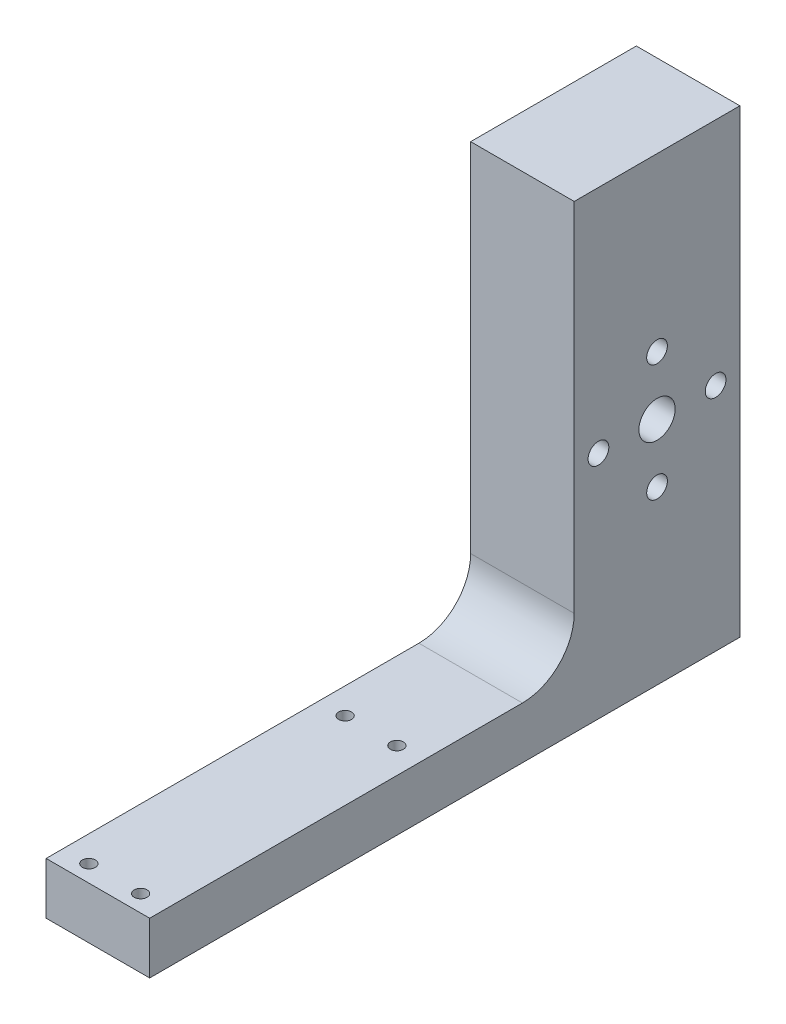
ISO-10303-21;
HEADER;
FILE_DESCRIPTION(('STEP AP214'),'2;1');
FILE_NAME('part.step','',(''),(''),'','','');
FILE_SCHEMA(('AUTOMOTIVE_DESIGN { 1 0 10303 214 1 1 1 1 }'));
ENDSEC;
DATA;
#1=APPLICATION_CONTEXT('core data for automotive mechanical design processes');
#2=APPLICATION_PROTOCOL_DEFINITION('international standard','automotive_design',2000,#1);
#3=PRODUCT_CONTEXT('',#1,'mechanical');
#4=PRODUCT('Part','Part','',(#3));
#5=PRODUCT_RELATED_PRODUCT_CATEGORY('part','',(#4));
#6=PRODUCT_DEFINITION_FORMATION('','',#4);
#7=PRODUCT_DEFINITION_CONTEXT('part definition',#1,'design');
#8=PRODUCT_DEFINITION('design','',#6,#7);
#9=PRODUCT_DEFINITION_SHAPE('','',#8);
#10=(LENGTH_UNIT() NAMED_UNIT(*) SI_UNIT(.MILLI.,.METRE.));
#11=(NAMED_UNIT(*) PLANE_ANGLE_UNIT() SI_UNIT($,.RADIAN.));
#12=(NAMED_UNIT(*) SI_UNIT($,.STERADIAN.) SOLID_ANGLE_UNIT());
#13=UNCERTAINTY_MEASURE_WITH_UNIT(LENGTH_MEASURE(1.E-05),#10,'distance_accuracy_value','');
#14=(GEOMETRIC_REPRESENTATION_CONTEXT(3) GLOBAL_UNCERTAINTY_ASSIGNED_CONTEXT((#13)) GLOBAL_UNIT_ASSIGNED_CONTEXT((#10,
#11,#12)) REPRESENTATION_CONTEXT('',''));
#15=CARTESIAN_POINT('',(0.,0.,0.));
#16=DIRECTION('',(0.,0.,1.));
#17=DIRECTION('',(1.,0.,0.));
#18=AXIS2_PLACEMENT_3D('',#15,#16,#17);
#19=CARTESIAN_POINT('',(20.,10.,0.));
#20=DIRECTION('',(-1.,0.,0.));
#21=DIRECTION('',(0.,0.,1.));
#22=AXIS2_PLACEMENT_3D('',#19,#20,#21);
#23=PLANE('',#22);
#24=CARTESIAN_POINT('',(20.,44.45,-103.313708498985));
#25=DIRECTION('',(1.,0.,0.));
#26=DIRECTION('',(0.,0.,-1.));
#27=AXIS2_PLACEMENT_3D('',#24,#25,#26);
#28=CIRCLE('',#27,2.);
#29=CARTESIAN_POINT('',(20.,44.45,-105.313708498985));
#30=VERTEX_POINT('',#29);
#31=EDGE_CURVE('E352',#30,#30,#28,.T.);
#32=ORIENTED_EDGE('',*,*,#31,.F.);
#33=EDGE_LOOP('',(#32));
#34=FACE_BOUND('',#33,.T.);
#35=CARTESIAN_POINT('',(20.,33.1362915010152,-92.));
#36=DIRECTION('',(1.,0.,0.));
#37=DIRECTION('',(0.,0.,-1.));
#38=AXIS2_PLACEMENT_3D('',#35,#36,#37);
#39=CIRCLE('',#38,2.);
#40=CARTESIAN_POINT('',(20.,33.1362915010152,-94.));
#41=VERTEX_POINT('',#40);
#42=EDGE_CURVE('E351',#41,#41,#39,.T.);
#43=ORIENTED_EDGE('',*,*,#42,.F.);
#44=EDGE_LOOP('',(#43));
#45=FACE_BOUND('',#44,.T.);
#46=CARTESIAN_POINT('',(20.,44.45,-80.6862915010152));
#47=DIRECTION('',(1.,0.,0.));
#48=DIRECTION('',(0.,0.,-1.));
#49=AXIS2_PLACEMENT_3D('',#46,#47,#48);
#50=CIRCLE('',#49,2.);
#51=CARTESIAN_POINT('',(20.,44.45,-82.6862915010152));
#52=VERTEX_POINT('',#51);
#53=EDGE_CURVE('E353',#52,#52,#50,.T.);
#54=ORIENTED_EDGE('',*,*,#53,.F.);
#55=EDGE_LOOP('',(#54));
#56=FACE_BOUND('',#55,.T.);
#57=CARTESIAN_POINT('',(20.,55.7637084989848,-92.));
#58=DIRECTION('',(1.,0.,0.));
#59=DIRECTION('',(0.,0.,-1.));
#60=AXIS2_PLACEMENT_3D('',#57,#58,#59);
#61=CIRCLE('',#60,2.);
#62=CARTESIAN_POINT('',(20.,55.7637084989848,-94.));
#63=VERTEX_POINT('',#62);
#64=EDGE_CURVE('E357',#63,#63,#61,.T.);
#65=ORIENTED_EDGE('',*,*,#64,.F.);
#66=EDGE_LOOP('',(#65));
#67=FACE_BOUND('',#66,.T.);
#68=CARTESIAN_POINT('',(20.,44.45,-92.));
#69=DIRECTION('',(1.,0.,0.));
#70=DIRECTION('',(0.,0.,-1.));
#71=AXIS2_PLACEMENT_3D('',#68,#69,#70);
#72=CIRCLE('',#71,3.50000000000001);
#73=CARTESIAN_POINT('',(20.,44.45,-95.5));
#74=VERTEX_POINT('',#73);
#75=EDGE_CURVE('E125',#74,#74,#72,.T.);
#76=ORIENTED_EDGE('',*,*,#75,.F.);
#77=EDGE_LOOP('',(#76));
#78=FACE_BOUND('',#77,.T.);
#79=DIRECTION('',(0.,0.,-1.));
#80=VECTOR('',#79,1.);
#81=CARTESIAN_POINT('',(20.,0.,0.));
#82=LINE('',#81,#80);
#83=CARTESIAN_POINT('',(20.,0.,6.));
#84=VERTEX_POINT('',#83);
#85=CARTESIAN_POINT('',(20.,0.,-108.));
#86=VERTEX_POINT('',#85);
#87=EDGE_CURVE('E95',#84,#86,#82,.T.);
#88=ORIENTED_EDGE('',*,*,#87,.T.);
#89=DIRECTION('',(0.,-1.,0.));
#90=VECTOR('',#89,1.);
#91=CARTESIAN_POINT('',(20.,0.,-108.));
#92=LINE('',#91,#90);
#93=CARTESIAN_POINT('',(20.,88.9,-108.));
#94=VERTEX_POINT('',#93);
#95=EDGE_CURVE('E99',#94,#86,#92,.T.);
#96=ORIENTED_EDGE('',*,*,#95,.F.);
#97=DIRECTION('',(0.,0.,1.));
#98=VECTOR('',#97,1.);
#99=CARTESIAN_POINT('',(20.,88.9,-108.));
#100=LINE('',#99,#98);
#101=CARTESIAN_POINT('',(20.,88.9,-76.));
#102=VERTEX_POINT('',#101);
#103=EDGE_CURVE('E130',#94,#102,#100,.T.);
#104=ORIENTED_EDGE('',*,*,#103,.T.);
#105=DIRECTION('',(0.,-1.,0.));
#106=VECTOR('',#105,1.);
#107=CARTESIAN_POINT('',(20.,0.,-76.));
#108=LINE('',#107,#106);
#109=CARTESIAN_POINT('',(20.,20.,-76.));
#110=VERTEX_POINT('',#109);
#111=EDGE_CURVE('E131',#102,#110,#108,.T.);
#112=ORIENTED_EDGE('',*,*,#111,.T.);
#113=CARTESIAN_POINT('',(20.,20.,-66.));
#114=DIRECTION('',(-1.,0.,0.));
#115=DIRECTION('',(0.,0.,1.));
#116=AXIS2_PLACEMENT_3D('',#113,#114,#115);
#117=CIRCLE('',#116,10.);
#118=CARTESIAN_POINT('',(20.,10.,-66.));
#119=VERTEX_POINT('',#118);
#120=EDGE_CURVE('E44',#110,#119,#117,.T.);
#121=ORIENTED_EDGE('',*,*,#120,.T.);
#122=DIRECTION('',(0.,0.,-1.));
#123=VECTOR('',#122,1.);
#124=CARTESIAN_POINT('',(20.,10.,0.));
#125=LINE('',#124,#123);
#126=CARTESIAN_POINT('',(20.,10.,6.));
#127=VERTEX_POINT('',#126);
#128=EDGE_CURVE('E137',#127,#119,#125,.T.);
#129=ORIENTED_EDGE('',*,*,#128,.F.);
#130=DIRECTION('',(0.,-1.,0.));
#131=VECTOR('',#130,1.);
#132=CARTESIAN_POINT('',(20.,10.,6.));
#133=LINE('',#132,#131);
#134=EDGE_CURVE('E100',#127,#84,#133,.T.);
#135=ORIENTED_EDGE('',*,*,#134,.T.);
#136=EDGE_LOOP('',(#88,#96,#104,#112,#121,#129,#135));
#137=FACE_BOUND('',#136,.T.);
#138=ADVANCED_FACE('F35',(#34,#45,#56,#67,#78,#137),#23,.F.);
#139=CARTESIAN_POINT('',(0.,10.,0.));
#140=DIRECTION('',(-1.,0.,0.));
#141=DIRECTION('',(0.,0.,1.));
#142=AXIS2_PLACEMENT_3D('',#139,#140,#141);
#143=PLANE('',#142);
#144=CARTESIAN_POINT('',(0.,44.45,-103.313708498985));
#145=DIRECTION('',(-1.,0.,0.));
#146=DIRECTION('',(0.,0.,1.));
#147=AXIS2_PLACEMENT_3D('',#144,#145,#146);
#148=CIRCLE('',#147,2.);
#149=CARTESIAN_POINT('',(0.,44.45,-101.313708498985));
#150=VERTEX_POINT('',#149);
#151=EDGE_CURVE('E39',#150,#150,#148,.T.);
#152=ORIENTED_EDGE('',*,*,#151,.F.);
#153=EDGE_LOOP('',(#152));
#154=FACE_BOUND('',#153,.T.);
#155=CARTESIAN_POINT('',(0.,33.1362915010152,-92.));
#156=DIRECTION('',(-1.,0.,0.));
#157=DIRECTION('',(0.,0.,1.));
#158=AXIS2_PLACEMENT_3D('',#155,#156,#157);
#159=CIRCLE('',#158,2.);
#160=CARTESIAN_POINT('',(0.,33.1362915010152,-90.));
#161=VERTEX_POINT('',#160);
#162=EDGE_CURVE('E187',#161,#161,#159,.T.);
#163=ORIENTED_EDGE('',*,*,#162,.F.);
#164=EDGE_LOOP('',(#163));
#165=FACE_BOUND('',#164,.T.);
#166=CARTESIAN_POINT('',(0.,44.45,-80.6862915010152));
#167=DIRECTION('',(-1.,0.,0.));
#168=DIRECTION('',(0.,0.,1.));
#169=AXIS2_PLACEMENT_3D('',#166,#167,#168);
#170=CIRCLE('',#169,2.);
#171=CARTESIAN_POINT('',(0.,44.45,-78.6862915010152));
#172=VERTEX_POINT('',#171);
#173=EDGE_CURVE('E185',#172,#172,#170,.T.);
#174=ORIENTED_EDGE('',*,*,#173,.F.);
#175=EDGE_LOOP('',(#174));
#176=FACE_BOUND('',#175,.T.);
#177=CARTESIAN_POINT('',(0.,55.7637084989848,-92.));
#178=DIRECTION('',(-1.,0.,0.));
#179=DIRECTION('',(0.,0.,1.));
#180=AXIS2_PLACEMENT_3D('',#177,#178,#179);
#181=CIRCLE('',#180,2.);
#182=CARTESIAN_POINT('',(0.,55.7637084989848,-90.));
#183=VERTEX_POINT('',#182);
#184=EDGE_CURVE('E182',#183,#183,#181,.T.);
#185=ORIENTED_EDGE('',*,*,#184,.F.);
#186=EDGE_LOOP('',(#185));
#187=FACE_BOUND('',#186,.T.);
#188=CARTESIAN_POINT('',(0.,44.45,-92.));
#189=DIRECTION('',(-1.,0.,0.));
#190=DIRECTION('',(0.,0.,1.));
#191=AXIS2_PLACEMENT_3D('',#188,#189,#190);
#192=CIRCLE('',#191,3.50000000000001);
#193=CARTESIAN_POINT('',(0.,44.45,-88.5));
#194=VERTEX_POINT('',#193);
#195=EDGE_CURVE('E179',#194,#194,#192,.T.);
#196=ORIENTED_EDGE('',*,*,#195,.F.);
#197=EDGE_LOOP('',(#196));
#198=FACE_BOUND('',#197,.T.);
#199=DIRECTION('',(0.,0.,-1.));
#200=VECTOR('',#199,1.);
#201=CARTESIAN_POINT('',(0.,0.,0.));
#202=LINE('',#201,#200);
#203=CARTESIAN_POINT('',(0.,0.,6.));
#204=VERTEX_POINT('',#203);
#205=CARTESIAN_POINT('',(0.,0.,-108.));
#206=VERTEX_POINT('',#205);
#207=EDGE_CURVE('E104',#204,#206,#202,.T.);
#208=ORIENTED_EDGE('',*,*,#207,.F.);
#209=DIRECTION('',(0.,-1.,0.));
#210=VECTOR('',#209,1.);
#211=CARTESIAN_POINT('',(0.,10.,6.));
#212=LINE('',#211,#210);
#213=CARTESIAN_POINT('',(0.,10.,6.));
#214=VERTEX_POINT('',#213);
#215=EDGE_CURVE('E172',#214,#204,#212,.T.);
#216=ORIENTED_EDGE('',*,*,#215,.F.);
#217=DIRECTION('',(0.,0.,-1.));
#218=VECTOR('',#217,1.);
#219=CARTESIAN_POINT('',(0.,10.,0.));
#220=LINE('',#219,#218);
#221=CARTESIAN_POINT('',(0.,10.,-66.));
#222=VERTEX_POINT('',#221);
#223=EDGE_CURVE('E139',#214,#222,#220,.T.);
#224=ORIENTED_EDGE('',*,*,#223,.T.);
#225=CARTESIAN_POINT('',(0.,20.,-66.));
#226=DIRECTION('',(-1.,0.,0.));
#227=DIRECTION('',(0.,0.,1.));
#228=AXIS2_PLACEMENT_3D('',#225,#226,#227);
#229=CIRCLE('',#228,10.);
#230=CARTESIAN_POINT('',(0.,20.,-76.));
#231=VERTEX_POINT('',#230);
#232=EDGE_CURVE('E11',#222,#231,#229,.F.);
#233=ORIENTED_EDGE('',*,*,#232,.T.);
#234=DIRECTION('',(0.,1.,0.));
#235=VECTOR('',#234,1.);
#236=CARTESIAN_POINT('',(0.,0.,-76.));
#237=LINE('',#236,#235);
#238=CARTESIAN_POINT('',(0.,88.9,-76.));
#239=VERTEX_POINT('',#238);
#240=EDGE_CURVE('E122',#231,#239,#237,.T.);
#241=ORIENTED_EDGE('',*,*,#240,.T.);
#242=DIRECTION('',(0.,0.,1.));
#243=VECTOR('',#242,1.);
#244=CARTESIAN_POINT('',(0.,88.9,-108.));
#245=LINE('',#244,#243);
#246=CARTESIAN_POINT('',(0.,88.9,-108.));
#247=VERTEX_POINT('',#246);
#248=EDGE_CURVE('E105',#247,#239,#245,.T.);
#249=ORIENTED_EDGE('',*,*,#248,.F.);
#250=DIRECTION('',(0.,1.,0.));
#251=VECTOR('',#250,1.);
#252=CARTESIAN_POINT('',(0.,0.,-108.));
#253=LINE('',#252,#251);
#254=EDGE_CURVE('E114',#206,#247,#253,.T.);
#255=ORIENTED_EDGE('',*,*,#254,.F.);
#256=EDGE_LOOP('',(#208,#216,#224,#233,#241,#249,#255));
#257=FACE_BOUND('',#256,.T.);
#258=ADVANCED_FACE('F197',(#154,#165,#176,#187,#198,#257),#143,.T.);
#259=CARTESIAN_POINT('',(15.,10.,-46.75));
#260=DIRECTION('',(0.,-1.,0.));
#261=DIRECTION('',(0.,0.,-1.));
#262=AXIS2_PLACEMENT_3D('',#259,#260,#261);
#263=CYLINDRICAL_SURFACE('',#262,1.25);
#264=CARTESIAN_POINT('',(15.,10.,-46.75));
#265=DIRECTION('',(0.,1.,0.));
#266=DIRECTION('',(0.,0.,1.));
#267=AXIS2_PLACEMENT_3D('',#264,#265,#266);
#268=CIRCLE('',#267,1.25);
#269=CARTESIAN_POINT('',(15.,10.,-45.5));
#270=VERTEX_POINT('',#269);
#271=EDGE_CURVE('E151',#270,#270,#268,.T.);
#272=ORIENTED_EDGE('',*,*,#271,.T.);
#273=EDGE_LOOP('',(#272));
#274=FACE_BOUND('',#273,.T.);
#275=CARTESIAN_POINT('',(15.,0.,-46.75));
#276=DIRECTION('',(0.,1.,0.));
#277=DIRECTION('',(0.,0.,1.));
#278=AXIS2_PLACEMENT_3D('',#275,#276,#277);
#279=CIRCLE('',#278,1.25);
#280=CARTESIAN_POINT('',(15.,0.,-45.5));
#281=VERTEX_POINT('',#280);
#282=EDGE_CURVE('E166',#281,#281,#279,.T.);
#283=ORIENTED_EDGE('',*,*,#282,.F.);
#284=EDGE_LOOP('',(#283));
#285=FACE_BOUND('',#284,.T.);
#286=ADVANCED_FACE('F200',(#274,#285),#263,.F.);
#287=CARTESIAN_POINT('',(5.,10.,2.75));
#288=DIRECTION('',(0.,-1.,0.));
#289=DIRECTION('',(0.,0.,-1.));
#290=AXIS2_PLACEMENT_3D('',#287,#288,#289);
#291=CYLINDRICAL_SURFACE('',#290,1.25);
#292=CARTESIAN_POINT('',(5.,10.,2.75));
#293=DIRECTION('',(0.,1.,0.));
#294=DIRECTION('',(0.,0.,1.));
#295=AXIS2_PLACEMENT_3D('',#292,#293,#294);
#296=CIRCLE('',#295,1.25);
#297=CARTESIAN_POINT('',(5.,10.,4.));
#298=VERTEX_POINT('',#297);
#299=EDGE_CURVE('E148',#298,#298,#296,.T.);
#300=ORIENTED_EDGE('',*,*,#299,.T.);
#301=EDGE_LOOP('',(#300));
#302=FACE_BOUND('',#301,.T.);
#303=CARTESIAN_POINT('',(5.,0.,2.75));
#304=DIRECTION('',(0.,1.,0.));
#305=DIRECTION('',(0.,0.,1.));
#306=AXIS2_PLACEMENT_3D('',#303,#304,#305);
#307=CIRCLE('',#306,1.25);
#308=CARTESIAN_POINT('',(5.,0.,4.));
#309=VERTEX_POINT('',#308);
#310=EDGE_CURVE('E163',#309,#309,#307,.T.);
#311=ORIENTED_EDGE('',*,*,#310,.F.);
#312=EDGE_LOOP('',(#311));
#313=FACE_BOUND('',#312,.T.);
#314=ADVANCED_FACE('F248',(#302,#313),#291,.F.);
#315=CARTESIAN_POINT('',(15.,10.,2.75));
#316=DIRECTION('',(0.,-1.,0.));
#317=DIRECTION('',(0.,0.,-1.));
#318=AXIS2_PLACEMENT_3D('',#315,#316,#317);
#319=CYLINDRICAL_SURFACE('',#318,1.25);
#320=CARTESIAN_POINT('',(15.,10.,2.75));
#321=DIRECTION('',(0.,1.,0.));
#322=DIRECTION('',(0.,0.,1.));
#323=AXIS2_PLACEMENT_3D('',#320,#321,#322);
#324=CIRCLE('',#323,1.25);
#325=CARTESIAN_POINT('',(15.,10.,4.));
#326=VERTEX_POINT('',#325);
#327=EDGE_CURVE('E145',#326,#326,#324,.T.);
#328=ORIENTED_EDGE('',*,*,#327,.T.);
#329=EDGE_LOOP('',(#328));
#330=FACE_BOUND('',#329,.T.);
#331=CARTESIAN_POINT('',(15.,0.,2.75));
#332=DIRECTION('',(0.,1.,0.));
#333=DIRECTION('',(0.,0.,1.));
#334=AXIS2_PLACEMENT_3D('',#331,#332,#333);
#335=CIRCLE('',#334,1.25);
#336=CARTESIAN_POINT('',(15.,0.,4.));
#337=VERTEX_POINT('',#336);
#338=EDGE_CURVE('E160',#337,#337,#335,.T.);
#339=ORIENTED_EDGE('',*,*,#338,.F.);
#340=EDGE_LOOP('',(#339));
#341=FACE_BOUND('',#340,.T.);
#342=ADVANCED_FACE('F245',(#330,#341),#319,.F.);
#343=CARTESIAN_POINT('',(0.,10.,6.));
#344=DIRECTION('',(0.,0.,1.));
#345=DIRECTION('',(1.,0.,0.));
#346=AXIS2_PLACEMENT_3D('',#343,#344,#345);
#347=PLANE('',#346);
#348=DIRECTION('',(-1.,0.,0.));
#349=VECTOR('',#348,1.);
#350=CARTESIAN_POINT('',(0.,0.,6.));
#351=LINE('',#350,#349);
#352=EDGE_CURVE('E158',#84,#204,#351,.T.);
#353=ORIENTED_EDGE('',*,*,#352,.F.);
#354=ORIENTED_EDGE('',*,*,#134,.F.);
#355=DIRECTION('',(-1.,0.,0.));
#356=VECTOR('',#355,1.);
#357=CARTESIAN_POINT('',(0.,10.,6.));
#358=LINE('',#357,#356);
#359=EDGE_CURVE('E142',#127,#214,#358,.T.);
#360=ORIENTED_EDGE('',*,*,#359,.T.);
#361=ORIENTED_EDGE('',*,*,#215,.T.);
#362=EDGE_LOOP('',(#353,#354,#360,#361));
#363=FACE_BOUND('',#362,.T.);
#364=ADVANCED_FACE('F211',(#363),#347,.T.);
#365=CARTESIAN_POINT('',(5.,10.,-46.75));
#366=DIRECTION('',(0.,-1.,0.));
#367=DIRECTION('',(0.,0.,-1.));
#368=AXIS2_PLACEMENT_3D('',#365,#366,#367);
#369=CYLINDRICAL_SURFACE('',#368,1.25);
#370=CARTESIAN_POINT('',(5.,10.,-46.75));
#371=DIRECTION('',(0.,1.,0.));
#372=DIRECTION('',(0.,0.,1.));
#373=AXIS2_PLACEMENT_3D('',#370,#371,#372);
#374=CIRCLE('',#373,1.25);
#375=CARTESIAN_POINT('',(5.,10.,-45.5));
#376=VERTEX_POINT('',#375);
#377=EDGE_CURVE('E154',#376,#376,#374,.T.);
#378=ORIENTED_EDGE('',*,*,#377,.T.);
#379=EDGE_LOOP('',(#378));
#380=FACE_BOUND('',#379,.T.);
#381=CARTESIAN_POINT('',(5.,0.,-46.75));
#382=DIRECTION('',(0.,1.,0.));
#383=DIRECTION('',(0.,0.,1.));
#384=AXIS2_PLACEMENT_3D('',#381,#382,#383);
#385=CIRCLE('',#384,1.25);
#386=CARTESIAN_POINT('',(5.,0.,-45.5));
#387=VERTEX_POINT('',#386);
#388=EDGE_CURVE('E140',#387,#387,#385,.T.);
#389=ORIENTED_EDGE('',*,*,#388,.F.);
#390=EDGE_LOOP('',(#389));
#391=FACE_BOUND('',#390,.T.);
#392=ADVANCED_FACE('F244',(#380,#391),#369,.F.);
#393=CARTESIAN_POINT('',(0.,10.,0.));
#394=DIRECTION('',(0.,1.,0.));
#395=DIRECTION('',(0.,0.,1.));
#396=AXIS2_PLACEMENT_3D('',#393,#394,#395);
#397=PLANE('',#396);
#398=ORIENTED_EDGE('',*,*,#128,.T.);
#399=DIRECTION('',(1.,0.,0.));
#400=VECTOR('',#399,1.);
#401=CARTESIAN_POINT('',(0.,10.,-66.));
#402=LINE('',#401,#400);
#403=EDGE_CURVE('E52',#119,#222,#402,.F.);
#404=ORIENTED_EDGE('',*,*,#403,.T.);
#405=ORIENTED_EDGE('',*,*,#223,.F.);
#406=ORIENTED_EDGE('',*,*,#359,.F.);
#407=EDGE_LOOP('',(#398,#404,#405,#406));
#408=FACE_BOUND('',#407,.T.);
#409=ORIENTED_EDGE('',*,*,#327,.F.);
#410=EDGE_LOOP('',(#409));
#411=FACE_BOUND('',#410,.T.);
#412=ORIENTED_EDGE('',*,*,#299,.F.);
#413=EDGE_LOOP('',(#412));
#414=FACE_BOUND('',#413,.T.);
#415=ORIENTED_EDGE('',*,*,#271,.F.);
#416=EDGE_LOOP('',(#415));
#417=FACE_BOUND('',#416,.T.);
#418=ORIENTED_EDGE('',*,*,#377,.F.);
#419=EDGE_LOOP('',(#418));
#420=FACE_BOUND('',#419,.T.);
#421=ADVANCED_FACE('F213',(#408,#411,#414,#417,#420),#397,.T.);
#422=CARTESIAN_POINT('',(0.,0.,0.));
#423=DIRECTION('',(0.,1.,0.));
#424=DIRECTION('',(0.,0.,1.));
#425=AXIS2_PLACEMENT_3D('',#422,#423,#424);
#426=PLANE('',#425);
#427=ORIENTED_EDGE('',*,*,#87,.F.);
#428=ORIENTED_EDGE('',*,*,#352,.T.);
#429=ORIENTED_EDGE('',*,*,#207,.T.);
#430=DIRECTION('',(-1.,0.,0.));
#431=VECTOR('',#430,1.);
#432=CARTESIAN_POINT('',(20.,0.,-108.));
#433=LINE('',#432,#431);
#434=EDGE_CURVE('E108',#86,#206,#433,.T.);
#435=ORIENTED_EDGE('',*,*,#434,.F.);
#436=EDGE_LOOP('',(#427,#428,#429,#435));
#437=FACE_BOUND('',#436,.T.);
#438=ORIENTED_EDGE('',*,*,#338,.T.);
#439=EDGE_LOOP('',(#438));
#440=FACE_BOUND('',#439,.T.);
#441=ORIENTED_EDGE('',*,*,#310,.T.);
#442=EDGE_LOOP('',(#441));
#443=FACE_BOUND('',#442,.T.);
#444=ORIENTED_EDGE('',*,*,#282,.T.);
#445=EDGE_LOOP('',(#444));
#446=FACE_BOUND('',#445,.T.);
#447=ORIENTED_EDGE('',*,*,#388,.T.);
#448=EDGE_LOOP('',(#447));
#449=FACE_BOUND('',#448,.T.);
#450=ADVANCED_FACE('F109',(#437,#440,#443,#446,#449),#426,.F.);
#451=CARTESIAN_POINT('',(20.,88.9,-108.));
#452=DIRECTION('',(0.,-1.,0.));
#453=DIRECTION('',(0.,0.,-1.));
#454=AXIS2_PLACEMENT_3D('',#451,#452,#453);
#455=PLANE('',#454);
#456=DIRECTION('',(1.,0.,0.));
#457=VECTOR('',#456,1.);
#458=CARTESIAN_POINT('',(20.,88.9,-76.));
#459=LINE('',#458,#457);
#460=EDGE_CURVE('E120',#239,#102,#459,.T.);
#461=ORIENTED_EDGE('',*,*,#460,.T.);
#462=ORIENTED_EDGE('',*,*,#103,.F.);
#463=DIRECTION('',(1.,0.,0.));
#464=VECTOR('',#463,1.);
#465=CARTESIAN_POINT('',(20.,88.9,-108.));
#466=LINE('',#465,#464);
#467=EDGE_CURVE('E118',#247,#94,#466,.T.);
#468=ORIENTED_EDGE('',*,*,#467,.F.);
#469=ORIENTED_EDGE('',*,*,#248,.T.);
#470=EDGE_LOOP('',(#461,#462,#468,#469));
#471=FACE_BOUND('',#470,.T.);
#472=ADVANCED_FACE('F224',(#471),#455,.F.);
#473=CARTESIAN_POINT('',(0.,0.,-108.));
#474=DIRECTION('',(0.,0.,1.));
#475=DIRECTION('',(1.,0.,0.));
#476=AXIS2_PLACEMENT_3D('',#473,#474,#475);
#477=PLANE('',#476);
#478=ORIENTED_EDGE('',*,*,#95,.T.);
#479=ORIENTED_EDGE('',*,*,#434,.T.);
#480=ORIENTED_EDGE('',*,*,#254,.T.);
#481=ORIENTED_EDGE('',*,*,#467,.T.);
#482=EDGE_LOOP('',(#478,#479,#480,#481));
#483=FACE_BOUND('',#482,.T.);
#484=ADVANCED_FACE('F116',(#483),#477,.F.);
#485=CARTESIAN_POINT('',(0.,0.,-76.));
#486=DIRECTION('',(0.,0.,1.));
#487=DIRECTION('',(1.,0.,0.));
#488=AXIS2_PLACEMENT_3D('',#485,#486,#487);
#489=PLANE('',#488);
#490=ORIENTED_EDGE('',*,*,#240,.F.);
#491=DIRECTION('',(1.,0.,0.));
#492=VECTOR('',#491,1.);
#493=CARTESIAN_POINT('',(20.,20.,-76.));
#494=LINE('',#493,#492);
#495=EDGE_CURVE('E174',#231,#110,#494,.T.);
#496=ORIENTED_EDGE('',*,*,#495,.T.);
#497=ORIENTED_EDGE('',*,*,#111,.F.);
#498=ORIENTED_EDGE('',*,*,#460,.F.);
#499=EDGE_LOOP('',(#490,#496,#497,#498));
#500=FACE_BOUND('',#499,.T.);
#501=ADVANCED_FACE('F221',(#500),#489,.T.);
#502=CARTESIAN_POINT('',(0.,20.,-66.));
#503=DIRECTION('',(-1.,0.,0.));
#504=DIRECTION('',(0.,0.,1.));
#505=AXIS2_PLACEMENT_3D('',#502,#503,#504);
#506=CYLINDRICAL_SURFACE('',#505,10.);
#507=ORIENTED_EDGE('',*,*,#232,.F.);
#508=ORIENTED_EDGE('',*,*,#403,.F.);
#509=ORIENTED_EDGE('',*,*,#120,.F.);
#510=ORIENTED_EDGE('',*,*,#495,.F.);
#511=EDGE_LOOP('',(#507,#508,#509,#510));
#512=FACE_BOUND('',#511,.T.);
#513=ADVANCED_FACE('F37',(#512),#506,.F.);
#514=CARTESIAN_POINT('',(-12.,44.45,-92.));
#515=DIRECTION('',(1.,0.,0.));
#516=DIRECTION('',(0.,0.,-1.));
#517=AXIS2_PLACEMENT_3D('',#514,#515,#516);
#518=CYLINDRICAL_SURFACE('',#517,3.50000000000001);
#519=ORIENTED_EDGE('',*,*,#195,.T.);
#520=EDGE_LOOP('',(#519));
#521=FACE_BOUND('',#520,.T.);
#522=ORIENTED_EDGE('',*,*,#75,.T.);
#523=EDGE_LOOP('',(#522));
#524=FACE_BOUND('',#523,.T.);
#525=ADVANCED_FACE('F295',(#521,#524),#518,.F.);
#526=CARTESIAN_POINT('',(-12.,55.7637084989848,-92.));
#527=DIRECTION('',(1.,0.,0.));
#528=DIRECTION('',(0.,0.,-1.));
#529=AXIS2_PLACEMENT_3D('',#526,#527,#528);
#530=CYLINDRICAL_SURFACE('',#529,2.);
#531=ORIENTED_EDGE('',*,*,#184,.T.);
#532=EDGE_LOOP('',(#531));
#533=FACE_BOUND('',#532,.T.);
#534=ORIENTED_EDGE('',*,*,#64,.T.);
#535=EDGE_LOOP('',(#534));
#536=FACE_BOUND('',#535,.T.);
#537=ADVANCED_FACE('F301',(#533,#536),#530,.F.);
#538=CARTESIAN_POINT('',(-12.,44.45,-80.6862915010152));
#539=DIRECTION('',(1.,0.,0.));
#540=DIRECTION('',(0.,0.,-1.));
#541=AXIS2_PLACEMENT_3D('',#538,#539,#540);
#542=CYLINDRICAL_SURFACE('',#541,2.);
#543=ORIENTED_EDGE('',*,*,#173,.T.);
#544=EDGE_LOOP('',(#543));
#545=FACE_BOUND('',#544,.T.);
#546=ORIENTED_EDGE('',*,*,#53,.T.);
#547=EDGE_LOOP('',(#546));
#548=FACE_BOUND('',#547,.T.);
#549=ADVANCED_FACE('F310',(#545,#548),#542,.F.);
#550=CARTESIAN_POINT('',(-12.,33.1362915010152,-92.));
#551=DIRECTION('',(1.,0.,0.));
#552=DIRECTION('',(0.,0.,-1.));
#553=AXIS2_PLACEMENT_3D('',#550,#551,#552);
#554=CYLINDRICAL_SURFACE('',#553,2.);
#555=ORIENTED_EDGE('',*,*,#162,.T.);
#556=EDGE_LOOP('',(#555));
#557=FACE_BOUND('',#556,.T.);
#558=ORIENTED_EDGE('',*,*,#42,.T.);
#559=EDGE_LOOP('',(#558));
#560=FACE_BOUND('',#559,.T.);
#561=ADVANCED_FACE('F318',(#557,#560),#554,.F.);
#562=CARTESIAN_POINT('',(-12.,44.45,-103.313708498985));
#563=DIRECTION('',(1.,0.,0.));
#564=DIRECTION('',(0.,0.,-1.));
#565=AXIS2_PLACEMENT_3D('',#562,#563,#564);
#566=CYLINDRICAL_SURFACE('',#565,2.);
#567=ORIENTED_EDGE('',*,*,#151,.T.);
#568=EDGE_LOOP('',(#567));
#569=FACE_BOUND('',#568,.T.);
#570=ORIENTED_EDGE('',*,*,#31,.T.);
#571=EDGE_LOOP('',(#570));
#572=FACE_BOUND('',#571,.T.);
#573=ADVANCED_FACE('F194',(#569,#572),#566,.F.);
#574=CLOSED_SHELL('',(#138,#258,#286,#314,#342,#364,#392,#421,#450,#472,#484,#501,#513,#525,
#537,#549,#561,#573));
#575=MANIFOLD_SOLID_BREP('B2',#574);
#576=ADVANCED_BREP_SHAPE_REPRESENTATION('',(#18,#575),#14);
#577=SHAPE_DEFINITION_REPRESENTATION(#9,#576);
ENDSEC;
END-ISO-10303-21;
